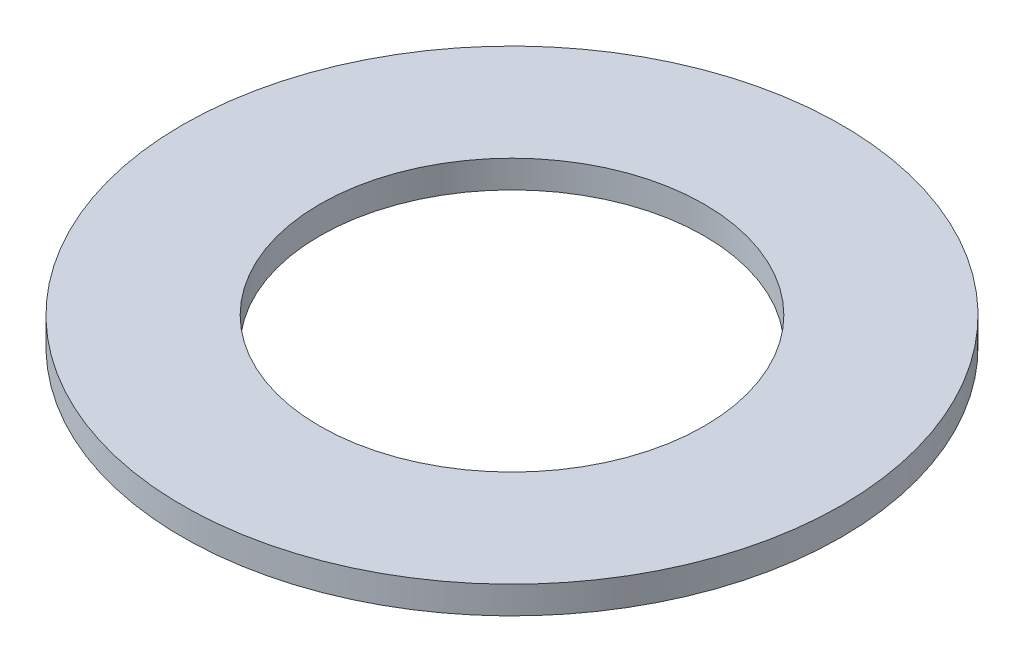
ISO-10303-21;
HEADER;
FILE_DESCRIPTION(('STEP AP214'),'2;1');
FILE_NAME('part.step','',(''),(''),'','','');
FILE_SCHEMA(('AUTOMOTIVE_DESIGN { 1 0 10303 214 1 1 1 1 }'));
ENDSEC;
DATA;
#1=APPLICATION_CONTEXT('core data for automotive mechanical design processes');
#2=APPLICATION_PROTOCOL_DEFINITION('international standard','automotive_design',2000,#1);
#3=PRODUCT_CONTEXT('',#1,'mechanical');
#4=PRODUCT('Part','Part','',(#3));
#5=PRODUCT_RELATED_PRODUCT_CATEGORY('part','',(#4));
#6=PRODUCT_DEFINITION_FORMATION('','',#4);
#7=PRODUCT_DEFINITION_CONTEXT('part definition',#1,'design');
#8=PRODUCT_DEFINITION('design','',#6,#7);
#9=PRODUCT_DEFINITION_SHAPE('','',#8);
#10=(LENGTH_UNIT() NAMED_UNIT(*) SI_UNIT(.MILLI.,.METRE.));
#11=(NAMED_UNIT(*) PLANE_ANGLE_UNIT() SI_UNIT($,.RADIAN.));
#12=(NAMED_UNIT(*) SI_UNIT($,.STERADIAN.) SOLID_ANGLE_UNIT());
#13=UNCERTAINTY_MEASURE_WITH_UNIT(LENGTH_MEASURE(1.E-05),#10,'distance_accuracy_value','');
#14=(GEOMETRIC_REPRESENTATION_CONTEXT(3) GLOBAL_UNCERTAINTY_ASSIGNED_CONTEXT((#13)) GLOBAL_UNIT_ASSIGNED_CONTEXT((#10,
#11,#12)) REPRESENTATION_CONTEXT('',''));
#15=CARTESIAN_POINT('',(0.,0.,0.));
#16=DIRECTION('',(0.,0.,1.));
#17=DIRECTION('',(1.,0.,0.));
#18=AXIS2_PLACEMENT_3D('',#15,#16,#17);
#19=CARTESIAN_POINT('',(0.,1.,0.));
#20=DIRECTION('',(0.,1.,0.));
#21=DIRECTION('',(0.,0.,1.));
#22=AXIS2_PLACEMENT_3D('',#19,#20,#21);
#23=PLANE('',#22);
#24=CARTESIAN_POINT('',(0.,1.,0.));
#25=DIRECTION('',(0.,1.,0.));
#26=DIRECTION('',(1.,0.,0.));
#27=AXIS2_PLACEMENT_3D('',#24,#25,#26);
#28=CIRCLE('',#27,12.);
#29=CARTESIAN_POINT('',(12.,1.,0.));
#30=VERTEX_POINT('',#29);
#31=EDGE_CURVE('E11',#30,#30,#28,.T.);
#32=ORIENTED_EDGE('',*,*,#31,.T.);
#33=EDGE_LOOP('',(#32));
#34=FACE_BOUND('',#33,.T.);
#35=CARTESIAN_POINT('',(0.,1.,0.));
#36=DIRECTION('',(0.,1.,0.));
#37=DIRECTION('',(0.,0.,1.));
#38=AXIS2_PLACEMENT_3D('',#35,#36,#37);
#39=CIRCLE('',#38,7.);
#40=CARTESIAN_POINT('',(0.,1.,7.));
#41=VERTEX_POINT('',#40);
#42=EDGE_CURVE('E49',#41,#41,#39,.T.);
#43=ORIENTED_EDGE('',*,*,#42,.F.);
#44=EDGE_LOOP('',(#43));
#45=FACE_BOUND('',#44,.T.);
#46=ADVANCED_FACE('F38',(#34,#45),#23,.T.);
#47=CARTESIAN_POINT('',(0.,0.,0.));
#48=DIRECTION('',(0.,1.,0.));
#49=DIRECTION('',(0.,0.,1.));
#50=AXIS2_PLACEMENT_3D('',#47,#48,#49);
#51=PLANE('',#50);
#52=CARTESIAN_POINT('',(0.,0.,0.));
#53=DIRECTION('',(0.,1.,0.));
#54=DIRECTION('',(1.,0.,0.));
#55=AXIS2_PLACEMENT_3D('',#52,#53,#54);
#56=CIRCLE('',#55,12.);
#57=CARTESIAN_POINT('',(12.,0.,0.));
#58=VERTEX_POINT('',#57);
#59=EDGE_CURVE('E42',#58,#58,#56,.T.);
#60=ORIENTED_EDGE('',*,*,#59,.F.);
#61=EDGE_LOOP('',(#60));
#62=FACE_BOUND('',#61,.T.);
#63=CARTESIAN_POINT('',(0.,0.,0.));
#64=DIRECTION('',(0.,1.,0.));
#65=DIRECTION('',(0.,0.,1.));
#66=AXIS2_PLACEMENT_3D('',#63,#64,#65);
#67=CIRCLE('',#66,7.);
#68=CARTESIAN_POINT('',(0.,0.,7.));
#69=VERTEX_POINT('',#68);
#70=EDGE_CURVE('E51',#69,#69,#67,.T.);
#71=ORIENTED_EDGE('',*,*,#70,.T.);
#72=EDGE_LOOP('',(#71));
#73=FACE_BOUND('',#72,.T.);
#74=ADVANCED_FACE('F61',(#62,#73),#51,.F.);
#75=CARTESIAN_POINT('',(0.,1.,0.));
#76=DIRECTION('',(0.,-1.,0.));
#77=DIRECTION('',(0.,0.,-1.));
#78=AXIS2_PLACEMENT_3D('',#75,#76,#77);
#79=CYLINDRICAL_SURFACE('',#78,12.);
#80=ORIENTED_EDGE('',*,*,#31,.F.);
#81=EDGE_LOOP('',(#80));
#82=FACE_BOUND('',#81,.T.);
#83=ORIENTED_EDGE('',*,*,#59,.T.);
#84=EDGE_LOOP('',(#83));
#85=FACE_BOUND('',#84,.T.);
#86=ADVANCED_FACE('F40',(#82,#85),#79,.T.);
#87=CARTESIAN_POINT('',(0.,1.,0.));
#88=DIRECTION('',(0.,-1.,0.));
#89=DIRECTION('',(0.,0.,-1.));
#90=AXIS2_PLACEMENT_3D('',#87,#88,#89);
#91=CYLINDRICAL_SURFACE('',#90,7.);
#92=ORIENTED_EDGE('',*,*,#42,.T.);
#93=EDGE_LOOP('',(#92));
#94=FACE_BOUND('',#93,.T.);
#95=ORIENTED_EDGE('',*,*,#70,.F.);
#96=EDGE_LOOP('',(#95));
#97=FACE_BOUND('',#96,.T.);
#98=ADVANCED_FACE('F57',(#94,#97),#91,.F.);
#99=CLOSED_SHELL('',(#46,#74,#86,#98));
#100=MANIFOLD_SOLID_BREP('B2',#99);
#101=ADVANCED_BREP_SHAPE_REPRESENTATION('',(#18,#100),#14);
#102=SHAPE_DEFINITION_REPRESENTATION(#9,#101);
ENDSEC;
END-ISO-10303-21;
